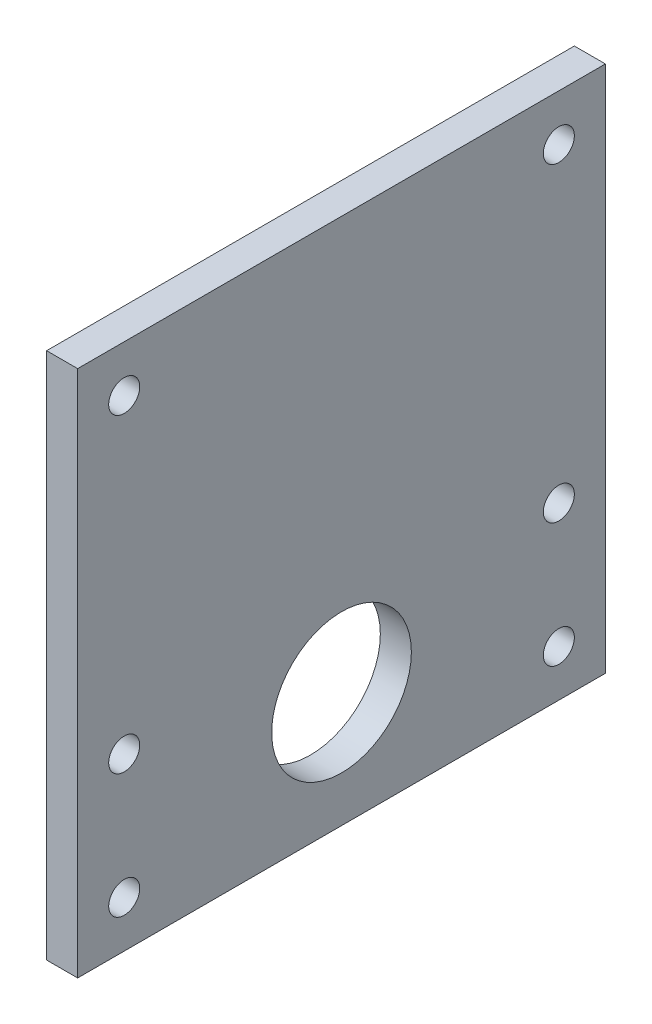
ISO-10303-21;
HEADER;
FILE_DESCRIPTION(('STEP AP214'),'2;1');
FILE_NAME('part.step','',(''),(''),'','','');
FILE_SCHEMA(('AUTOMOTIVE_DESIGN { 1 0 10303 214 1 1 1 1 }'));
ENDSEC;
DATA;
#1=APPLICATION_CONTEXT('core data for automotive mechanical design processes');
#2=APPLICATION_PROTOCOL_DEFINITION('international standard','automotive_design',2000,#1);
#3=PRODUCT_CONTEXT('',#1,'mechanical');
#4=PRODUCT('Part','Part','',(#3));
#5=PRODUCT_RELATED_PRODUCT_CATEGORY('part','',(#4));
#6=PRODUCT_DEFINITION_FORMATION('','',#4);
#7=PRODUCT_DEFINITION_CONTEXT('part definition',#1,'design');
#8=PRODUCT_DEFINITION('design','',#6,#7);
#9=PRODUCT_DEFINITION_SHAPE('','',#8);
#10=(LENGTH_UNIT() NAMED_UNIT(*) SI_UNIT(.MILLI.,.METRE.));
#11=(NAMED_UNIT(*) PLANE_ANGLE_UNIT() SI_UNIT($,.RADIAN.));
#12=(NAMED_UNIT(*) SI_UNIT($,.STERADIAN.) SOLID_ANGLE_UNIT());
#13=UNCERTAINTY_MEASURE_WITH_UNIT(LENGTH_MEASURE(1.E-05),#10,'distance_accuracy_value','');
#14=(GEOMETRIC_REPRESENTATION_CONTEXT(3) GLOBAL_UNCERTAINTY_ASSIGNED_CONTEXT((#13)) GLOBAL_UNIT_ASSIGNED_CONTEXT((#10,
#11,#12)) REPRESENTATION_CONTEXT('',''));
#15=CARTESIAN_POINT('',(0.,0.,0.));
#16=DIRECTION('',(0.,0.,1.));
#17=DIRECTION('',(1.,0.,0.));
#18=AXIS2_PLACEMENT_3D('',#15,#16,#17);
#19=CARTESIAN_POINT('',(3.175,0.,0.));
#20=DIRECTION('',(-1.,0.,0.));
#21=DIRECTION('',(0.,0.,1.));
#22=AXIS2_PLACEMENT_3D('',#19,#20,#21);
#23=PLANE('',#22);
#24=DIRECTION('',(0.,1.,0.));
#25=VECTOR('',#24,1.);
#26=CARTESIAN_POINT('',(3.175,-53.975,-53.975));
#27=LINE('',#26,#25);
#28=CARTESIAN_POINT('',(3.175,-53.975,-53.975));
#29=VERTEX_POINT('',#28);
#30=CARTESIAN_POINT('',(3.175,53.975,-53.975));
#31=VERTEX_POINT('',#30);
#32=EDGE_CURVE('E86',#29,#31,#27,.T.);
#33=ORIENTED_EDGE('',*,*,#32,.T.);
#34=DIRECTION('',(0.,0.,1.));
#35=VECTOR('',#34,1.);
#36=CARTESIAN_POINT('',(3.175,53.975,53.975));
#37=LINE('',#36,#35);
#38=CARTESIAN_POINT('',(3.175,53.975,53.975));
#39=VERTEX_POINT('',#38);
#40=EDGE_CURVE('E81',#31,#39,#37,.T.);
#41=ORIENTED_EDGE('',*,*,#40,.T.);
#42=DIRECTION('',(0.,-1.,0.));
#43=VECTOR('',#42,1.);
#44=CARTESIAN_POINT('',(3.175,-53.975,53.975));
#45=LINE('',#44,#43);
#46=CARTESIAN_POINT('',(3.175,-53.975,53.975));
#47=VERTEX_POINT('',#46);
#48=EDGE_CURVE('E84',#39,#47,#45,.T.);
#49=ORIENTED_EDGE('',*,*,#48,.T.);
#50=DIRECTION('',(0.,0.,-1.));
#51=VECTOR('',#50,1.);
#52=CARTESIAN_POINT('',(3.175,-53.975,53.975));
#53=LINE('',#52,#51);
#54=EDGE_CURVE('E51',#47,#29,#53,.T.);
#55=ORIENTED_EDGE('',*,*,#54,.T.);
#56=EDGE_LOOP('',(#33,#41,#49,#55));
#57=FACE_BOUND('',#56,.T.);
#58=CARTESIAN_POINT('',(3.175,44.4499999999996,44.4499999999993));
#59=DIRECTION('',(1.,0.,0.));
#60=DIRECTION('',(0.,0.,-1.));
#61=AXIS2_PLACEMENT_3D('',#58,#59,#60);
#62=CIRCLE('',#61,3.175);
#63=CARTESIAN_POINT('',(3.175,44.4499999999996,41.2749999999993));
#64=VERTEX_POINT('',#63);
#65=EDGE_CURVE('E101',#64,#64,#62,.T.);
#66=ORIENTED_EDGE('',*,*,#65,.F.);
#67=EDGE_LOOP('',(#66));
#68=FACE_BOUND('',#67,.T.);
#69=CARTESIAN_POINT('',(3.175,-19.05,44.45));
#70=DIRECTION('',(1.,0.,0.));
#71=DIRECTION('',(0.,0.,-1.));
#72=AXIS2_PLACEMENT_3D('',#69,#70,#71);
#73=CIRCLE('',#72,3.175);
#74=CARTESIAN_POINT('',(3.175,-19.05,41.275));
#75=VERTEX_POINT('',#74);
#76=EDGE_CURVE('E116',#75,#75,#73,.T.);
#77=ORIENTED_EDGE('',*,*,#76,.F.);
#78=EDGE_LOOP('',(#77));
#79=FACE_BOUND('',#78,.T.);
#80=CARTESIAN_POINT('',(3.175,-44.4499999999987,44.4500000000003));
#81=DIRECTION('',(1.,0.,0.));
#82=DIRECTION('',(0.,0.,-1.));
#83=AXIS2_PLACEMENT_3D('',#80,#81,#82);
#84=CIRCLE('',#83,3.175);
#85=CARTESIAN_POINT('',(3.175,-44.4499999999987,41.2750000000003));
#86=VERTEX_POINT('',#85);
#87=EDGE_CURVE('E122',#86,#86,#84,.T.);
#88=ORIENTED_EDGE('',*,*,#87,.F.);
#89=EDGE_LOOP('',(#88));
#90=FACE_BOUND('',#89,.T.);
#91=CARTESIAN_POINT('',(3.175,-44.45,-44.45));
#92=DIRECTION('',(1.,0.,0.));
#93=DIRECTION('',(0.,0.,-1.));
#94=AXIS2_PLACEMENT_3D('',#91,#92,#93);
#95=CIRCLE('',#94,3.175);
#96=CARTESIAN_POINT('',(3.175,-44.45,-47.625));
#97=VERTEX_POINT('',#96);
#98=EDGE_CURVE('E128',#97,#97,#95,.T.);
#99=ORIENTED_EDGE('',*,*,#98,.F.);
#100=EDGE_LOOP('',(#99));
#101=FACE_BOUND('',#100,.T.);
#102=CARTESIAN_POINT('',(3.175,-19.05,-44.45));
#103=DIRECTION('',(1.,0.,0.));
#104=DIRECTION('',(0.,0.,-1.));
#105=AXIS2_PLACEMENT_3D('',#102,#103,#104);
#106=CIRCLE('',#105,3.175);
#107=CARTESIAN_POINT('',(3.175,-19.05,-47.625));
#108=VERTEX_POINT('',#107);
#109=EDGE_CURVE('E134',#108,#108,#106,.T.);
#110=ORIENTED_EDGE('',*,*,#109,.F.);
#111=EDGE_LOOP('',(#110));
#112=FACE_BOUND('',#111,.T.);
#113=CARTESIAN_POINT('',(3.175,44.45,-44.45));
#114=DIRECTION('',(1.,0.,0.));
#115=DIRECTION('',(0.,0.,-1.));
#116=AXIS2_PLACEMENT_3D('',#113,#114,#115);
#117=CIRCLE('',#116,3.175);
#118=CARTESIAN_POINT('',(3.175,44.45,-47.625));
#119=VERTEX_POINT('',#118);
#120=EDGE_CURVE('E140',#119,#119,#117,.T.);
#121=ORIENTED_EDGE('',*,*,#120,.F.);
#122=EDGE_LOOP('',(#121));
#123=FACE_BOUND('',#122,.T.);
#124=CARTESIAN_POINT('',(3.175,-30.3574660819983,0.));
#125=DIRECTION('',(1.,0.,0.));
#126=DIRECTION('',(0.,0.,-1.));
#127=AXIS2_PLACEMENT_3D('',#124,#125,#126);
#128=CIRCLE('',#127,14.2875);
#129=CARTESIAN_POINT('',(3.175,-30.3574660819983,-14.2875));
#130=VERTEX_POINT('',#129);
#131=EDGE_CURVE('E146',#130,#130,#128,.T.);
#132=ORIENTED_EDGE('',*,*,#131,.F.);
#133=EDGE_LOOP('',(#132));
#134=FACE_BOUND('',#133,.T.);
#135=ADVANCED_FACE('F34',(#57,#68,#79,#90,#101,#112,#123,#134),#23,.F.);
#136=CARTESIAN_POINT('',(-3.175,0.,0.));
#137=DIRECTION('',(-1.,0.,0.));
#138=DIRECTION('',(0.,0.,1.));
#139=AXIS2_PLACEMENT_3D('',#136,#137,#138);
#140=PLANE('',#139);
#141=CARTESIAN_POINT('',(-3.175,44.45,-44.45));
#142=DIRECTION('',(1.,0.,0.));
#143=DIRECTION('',(0.,0.,-1.));
#144=AXIS2_PLACEMENT_3D('',#141,#142,#143);
#145=CIRCLE('',#144,3.175);
#146=CARTESIAN_POINT('',(-3.175,44.45,-47.625));
#147=VERTEX_POINT('',#146);
#148=EDGE_CURVE('E143',#147,#147,#145,.T.);
#149=ORIENTED_EDGE('',*,*,#148,.T.);
#150=EDGE_LOOP('',(#149));
#151=FACE_BOUND('',#150,.T.);
#152=CARTESIAN_POINT('',(-3.175,-44.45,-44.45));
#153=DIRECTION('',(1.,0.,0.));
#154=DIRECTION('',(0.,0.,-1.));
#155=AXIS2_PLACEMENT_3D('',#152,#153,#154);
#156=CIRCLE('',#155,3.175);
#157=CARTESIAN_POINT('',(-3.175,-44.45,-47.625));
#158=VERTEX_POINT('',#157);
#159=EDGE_CURVE('E131',#158,#158,#156,.T.);
#160=ORIENTED_EDGE('',*,*,#159,.T.);
#161=EDGE_LOOP('',(#160));
#162=FACE_BOUND('',#161,.T.);
#163=CARTESIAN_POINT('',(-3.175,-19.05,44.45));
#164=DIRECTION('',(1.,0.,0.));
#165=DIRECTION('',(0.,0.,-1.));
#166=AXIS2_PLACEMENT_3D('',#163,#164,#165);
#167=CIRCLE('',#166,3.175);
#168=CARTESIAN_POINT('',(-3.175,-19.05,41.275));
#169=VERTEX_POINT('',#168);
#170=EDGE_CURVE('E119',#169,#169,#167,.T.);
#171=ORIENTED_EDGE('',*,*,#170,.T.);
#172=EDGE_LOOP('',(#171));
#173=FACE_BOUND('',#172,.T.);
#174=DIRECTION('',(0.,1.,0.));
#175=VECTOR('',#174,1.);
#176=CARTESIAN_POINT('',(-3.175,-53.975,-53.975));
#177=LINE('',#176,#175);
#178=CARTESIAN_POINT('',(-3.175,-53.975,-53.975));
#179=VERTEX_POINT('',#178);
#180=CARTESIAN_POINT('',(-3.175,53.975,-53.975));
#181=VERTEX_POINT('',#180);
#182=EDGE_CURVE('E98',#179,#181,#177,.T.);
#183=ORIENTED_EDGE('',*,*,#182,.F.);
#184=DIRECTION('',(0.,0.,-1.));
#185=VECTOR('',#184,1.);
#186=CARTESIAN_POINT('',(-3.175,-53.975,53.975));
#187=LINE('',#186,#185);
#188=CARTESIAN_POINT('',(-3.175,-53.975,53.975));
#189=VERTEX_POINT('',#188);
#190=EDGE_CURVE('E74',#189,#179,#187,.T.);
#191=ORIENTED_EDGE('',*,*,#190,.F.);
#192=DIRECTION('',(0.,-1.,0.));
#193=VECTOR('',#192,1.);
#194=CARTESIAN_POINT('',(-3.175,-53.975,53.975));
#195=LINE('',#194,#193);
#196=CARTESIAN_POINT('',(-3.175,53.975,53.975));
#197=VERTEX_POINT('',#196);
#198=EDGE_CURVE('E68',#197,#189,#195,.T.);
#199=ORIENTED_EDGE('',*,*,#198,.F.);
#200=DIRECTION('',(0.,0.,1.));
#201=VECTOR('',#200,1.);
#202=CARTESIAN_POINT('',(-3.175,53.975,53.975));
#203=LINE('',#202,#201);
#204=EDGE_CURVE('E90',#181,#197,#203,.T.);
#205=ORIENTED_EDGE('',*,*,#204,.F.);
#206=EDGE_LOOP('',(#183,#191,#199,#205));
#207=FACE_BOUND('',#206,.T.);
#208=CARTESIAN_POINT('',(-3.175,44.4499999999996,44.4499999999993));
#209=DIRECTION('',(1.,0.,0.));
#210=DIRECTION('',(0.,0.,-1.));
#211=AXIS2_PLACEMENT_3D('',#208,#209,#210);
#212=CIRCLE('',#211,3.175);
#213=CARTESIAN_POINT('',(-3.175,44.4499999999996,41.2749999999993));
#214=VERTEX_POINT('',#213);
#215=EDGE_CURVE('E113',#214,#214,#212,.T.);
#216=ORIENTED_EDGE('',*,*,#215,.T.);
#217=EDGE_LOOP('',(#216));
#218=FACE_BOUND('',#217,.T.);
#219=CARTESIAN_POINT('',(-3.175,-44.4499999999987,44.4500000000003));
#220=DIRECTION('',(1.,0.,0.));
#221=DIRECTION('',(0.,0.,-1.));
#222=AXIS2_PLACEMENT_3D('',#219,#220,#221);
#223=CIRCLE('',#222,3.175);
#224=CARTESIAN_POINT('',(-3.175,-44.4499999999987,41.2750000000003));
#225=VERTEX_POINT('',#224);
#226=EDGE_CURVE('E125',#225,#225,#223,.T.);
#227=ORIENTED_EDGE('',*,*,#226,.T.);
#228=EDGE_LOOP('',(#227));
#229=FACE_BOUND('',#228,.T.);
#230=CARTESIAN_POINT('',(-3.175,-19.05,-44.45));
#231=DIRECTION('',(1.,0.,0.));
#232=DIRECTION('',(0.,0.,-1.));
#233=AXIS2_PLACEMENT_3D('',#230,#231,#232);
#234=CIRCLE('',#233,3.175);
#235=CARTESIAN_POINT('',(-3.175,-19.05,-47.625));
#236=VERTEX_POINT('',#235);
#237=EDGE_CURVE('E137',#236,#236,#234,.T.);
#238=ORIENTED_EDGE('',*,*,#237,.T.);
#239=EDGE_LOOP('',(#238));
#240=FACE_BOUND('',#239,.T.);
#241=CARTESIAN_POINT('',(-3.175,-30.3574660819983,0.));
#242=DIRECTION('',(1.,0.,0.));
#243=DIRECTION('',(0.,0.,-1.));
#244=AXIS2_PLACEMENT_3D('',#241,#242,#243);
#245=CIRCLE('',#244,14.2875);
#246=CARTESIAN_POINT('',(-3.175,-30.3574660819983,-14.2875));
#247=VERTEX_POINT('',#246);
#248=EDGE_CURVE('E149',#247,#247,#245,.T.);
#249=ORIENTED_EDGE('',*,*,#248,.T.);
#250=EDGE_LOOP('',(#249));
#251=FACE_BOUND('',#250,.T.);
#252=ADVANCED_FACE('F109',(#151,#162,#173,#207,#218,#229,#240,#251),#140,.T.);
#253=CARTESIAN_POINT('',(3.175,-53.975,-53.975));
#254=DIRECTION('',(0.,0.,1.));
#255=DIRECTION('',(1.,0.,0.));
#256=AXIS2_PLACEMENT_3D('',#253,#254,#255);
#257=PLANE('',#256);
#258=ORIENTED_EDGE('',*,*,#182,.T.);
#259=DIRECTION('',(-1.,0.,0.));
#260=VECTOR('',#259,1.);
#261=CARTESIAN_POINT('',(3.175,53.975,-53.975));
#262=LINE('',#261,#260);
#263=EDGE_CURVE('E11',#31,#181,#262,.T.);
#264=ORIENTED_EDGE('',*,*,#263,.F.);
#265=ORIENTED_EDGE('',*,*,#32,.F.);
#266=DIRECTION('',(-1.,0.,0.));
#267=VECTOR('',#266,1.);
#268=CARTESIAN_POINT('',(3.175,-53.975,-53.975));
#269=LINE('',#268,#267);
#270=EDGE_CURVE('E94',#29,#179,#269,.T.);
#271=ORIENTED_EDGE('',*,*,#270,.T.);
#272=EDGE_LOOP('',(#258,#264,#265,#271));
#273=FACE_BOUND('',#272,.T.);
#274=ADVANCED_FACE('F36',(#273),#257,.F.);
#275=CARTESIAN_POINT('',(3.175,53.975,53.975));
#276=DIRECTION('',(0.,-1.,0.));
#277=DIRECTION('',(0.,0.,-1.));
#278=AXIS2_PLACEMENT_3D('',#275,#276,#277);
#279=PLANE('',#278);
#280=ORIENTED_EDGE('',*,*,#204,.T.);
#281=DIRECTION('',(-1.,0.,0.));
#282=VECTOR('',#281,1.);
#283=CARTESIAN_POINT('',(3.175,53.975,53.975));
#284=LINE('',#283,#282);
#285=EDGE_CURVE('E43',#39,#197,#284,.T.);
#286=ORIENTED_EDGE('',*,*,#285,.F.);
#287=ORIENTED_EDGE('',*,*,#40,.F.);
#288=ORIENTED_EDGE('',*,*,#263,.T.);
#289=EDGE_LOOP('',(#280,#286,#287,#288));
#290=FACE_BOUND('',#289,.T.);
#291=ADVANCED_FACE('F89',(#290),#279,.F.);
#292=CARTESIAN_POINT('',(3.175,-53.975,53.975));
#293=DIRECTION('',(0.,0.,-1.));
#294=DIRECTION('',(-1.,0.,0.));
#295=AXIS2_PLACEMENT_3D('',#292,#293,#294);
#296=PLANE('',#295);
#297=ORIENTED_EDGE('',*,*,#198,.T.);
#298=DIRECTION('',(-1.,0.,0.));
#299=VECTOR('',#298,1.);
#300=CARTESIAN_POINT('',(3.175,-53.975,53.975));
#301=LINE('',#300,#299);
#302=EDGE_CURVE('E91',#47,#189,#301,.T.);
#303=ORIENTED_EDGE('',*,*,#302,.F.);
#304=ORIENTED_EDGE('',*,*,#48,.F.);
#305=ORIENTED_EDGE('',*,*,#285,.T.);
#306=EDGE_LOOP('',(#297,#303,#304,#305));
#307=FACE_BOUND('',#306,.T.);
#308=ADVANCED_FACE('F92',(#307),#296,.F.);
#309=CARTESIAN_POINT('',(3.175,-53.975,53.975));
#310=DIRECTION('',(0.,1.,0.));
#311=DIRECTION('',(0.,0.,1.));
#312=AXIS2_PLACEMENT_3D('',#309,#310,#311);
#313=PLANE('',#312);
#314=ORIENTED_EDGE('',*,*,#190,.T.);
#315=ORIENTED_EDGE('',*,*,#270,.F.);
#316=ORIENTED_EDGE('',*,*,#54,.F.);
#317=ORIENTED_EDGE('',*,*,#302,.T.);
#318=EDGE_LOOP('',(#314,#315,#316,#317));
#319=FACE_BOUND('',#318,.T.);
#320=ADVANCED_FACE('F106',(#319),#313,.F.);
#321=CARTESIAN_POINT('',(3.175,44.4499999999996,44.4499999999993));
#322=DIRECTION('',(-1.,0.,0.));
#323=DIRECTION('',(0.,0.,1.));
#324=AXIS2_PLACEMENT_3D('',#321,#322,#323);
#325=CYLINDRICAL_SURFACE('',#324,3.175);
#326=ORIENTED_EDGE('',*,*,#65,.T.);
#327=EDGE_LOOP('',(#326));
#328=FACE_BOUND('',#327,.T.);
#329=ORIENTED_EDGE('',*,*,#215,.F.);
#330=EDGE_LOOP('',(#329));
#331=FACE_BOUND('',#330,.T.);
#332=ADVANCED_FACE('F166',(#328,#331),#325,.F.);
#333=CARTESIAN_POINT('',(3.175,-19.05,44.45));
#334=DIRECTION('',(-1.,0.,0.));
#335=DIRECTION('',(0.,0.,1.));
#336=AXIS2_PLACEMENT_3D('',#333,#334,#335);
#337=CYLINDRICAL_SURFACE('',#336,3.175);
#338=ORIENTED_EDGE('',*,*,#76,.T.);
#339=EDGE_LOOP('',(#338));
#340=FACE_BOUND('',#339,.T.);
#341=ORIENTED_EDGE('',*,*,#170,.F.);
#342=EDGE_LOOP('',(#341));
#343=FACE_BOUND('',#342,.T.);
#344=ADVANCED_FACE('F212',(#340,#343),#337,.F.);
#345=CARTESIAN_POINT('',(3.175,-44.4499999999987,44.4500000000003));
#346=DIRECTION('',(-1.,0.,0.));
#347=DIRECTION('',(0.,0.,1.));
#348=AXIS2_PLACEMENT_3D('',#345,#346,#347);
#349=CYLINDRICAL_SURFACE('',#348,3.175);
#350=ORIENTED_EDGE('',*,*,#87,.T.);
#351=EDGE_LOOP('',(#350));
#352=FACE_BOUND('',#351,.T.);
#353=ORIENTED_EDGE('',*,*,#226,.F.);
#354=EDGE_LOOP('',(#353));
#355=FACE_BOUND('',#354,.T.);
#356=ADVANCED_FACE('F220',(#352,#355),#349,.F.);
#357=CARTESIAN_POINT('',(3.175,-44.45,-44.45));
#358=DIRECTION('',(-1.,0.,0.));
#359=DIRECTION('',(0.,0.,1.));
#360=AXIS2_PLACEMENT_3D('',#357,#358,#359);
#361=CYLINDRICAL_SURFACE('',#360,3.175);
#362=ORIENTED_EDGE('',*,*,#98,.T.);
#363=EDGE_LOOP('',(#362));
#364=FACE_BOUND('',#363,.T.);
#365=ORIENTED_EDGE('',*,*,#159,.F.);
#366=EDGE_LOOP('',(#365));
#367=FACE_BOUND('',#366,.T.);
#368=ADVANCED_FACE('F228',(#364,#367),#361,.F.);
#369=CARTESIAN_POINT('',(3.175,-19.05,-44.45));
#370=DIRECTION('',(-1.,0.,0.));
#371=DIRECTION('',(0.,0.,1.));
#372=AXIS2_PLACEMENT_3D('',#369,#370,#371);
#373=CYLINDRICAL_SURFACE('',#372,3.175);
#374=ORIENTED_EDGE('',*,*,#109,.T.);
#375=EDGE_LOOP('',(#374));
#376=FACE_BOUND('',#375,.T.);
#377=ORIENTED_EDGE('',*,*,#237,.F.);
#378=EDGE_LOOP('',(#377));
#379=FACE_BOUND('',#378,.T.);
#380=ADVANCED_FACE('F237',(#376,#379),#373,.F.);
#381=CARTESIAN_POINT('',(3.175,44.45,-44.45));
#382=DIRECTION('',(-1.,0.,0.));
#383=DIRECTION('',(0.,0.,1.));
#384=AXIS2_PLACEMENT_3D('',#381,#382,#383);
#385=CYLINDRICAL_SURFACE('',#384,3.175);
#386=ORIENTED_EDGE('',*,*,#120,.T.);
#387=EDGE_LOOP('',(#386));
#388=FACE_BOUND('',#387,.T.);
#389=ORIENTED_EDGE('',*,*,#148,.F.);
#390=EDGE_LOOP('',(#389));
#391=FACE_BOUND('',#390,.T.);
#392=ADVANCED_FACE('F246',(#388,#391),#385,.F.);
#393=CARTESIAN_POINT('',(3.175,-30.3574660819983,0.));
#394=DIRECTION('',(-1.,0.,0.));
#395=DIRECTION('',(0.,0.,1.));
#396=AXIS2_PLACEMENT_3D('',#393,#394,#395);
#397=CYLINDRICAL_SURFACE('',#396,14.2875);
#398=ORIENTED_EDGE('',*,*,#131,.T.);
#399=EDGE_LOOP('',(#398));
#400=FACE_BOUND('',#399,.T.);
#401=ORIENTED_EDGE('',*,*,#248,.F.);
#402=EDGE_LOOP('',(#401));
#403=FACE_BOUND('',#402,.T.);
#404=ADVANCED_FACE('F155',(#400,#403),#397,.F.);
#405=CLOSED_SHELL('',(#135,#252,#274,#291,#308,#320,#332,#344,#356,#368,#380,#392,#404));
#406=MANIFOLD_SOLID_BREP('B2',#405);
#407=ADVANCED_BREP_SHAPE_REPRESENTATION('',(#18,#406),#14);
#408=SHAPE_DEFINITION_REPRESENTATION(#9,#407);
ENDSEC;
END-ISO-10303-21;
